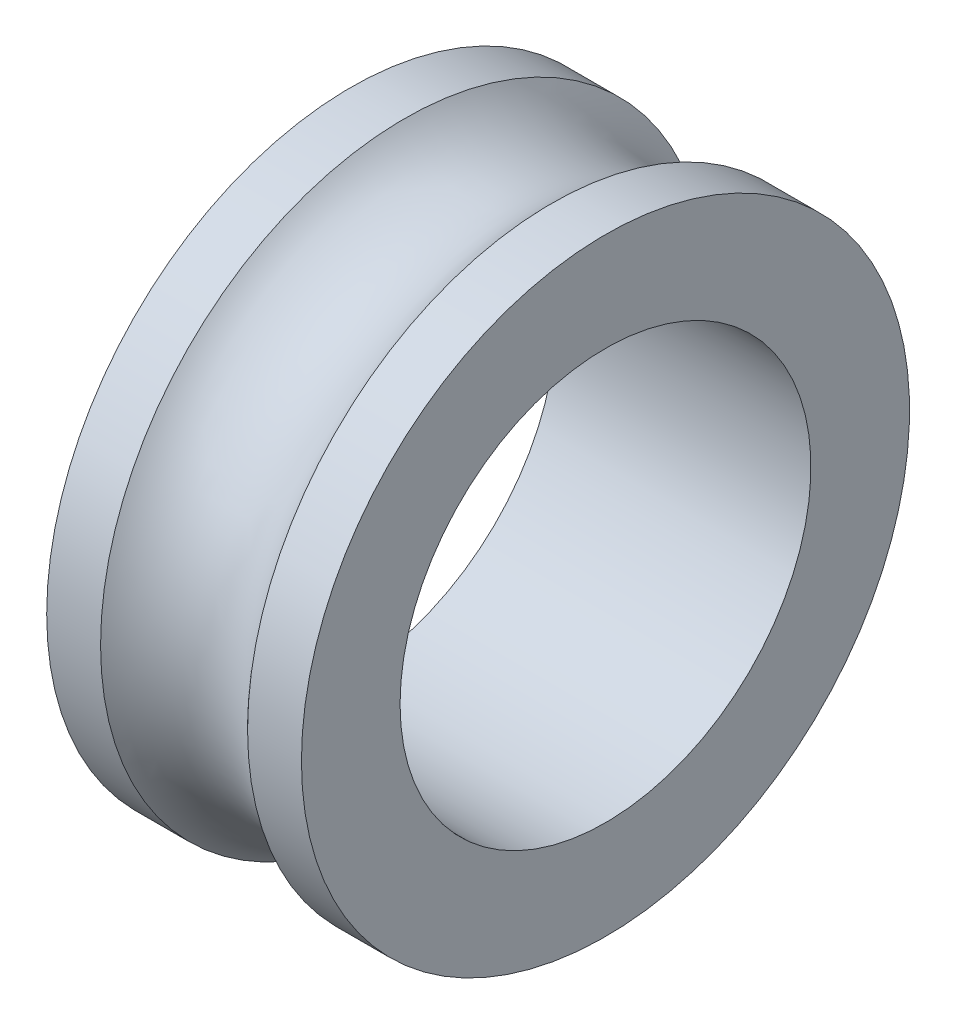
ISO-10303-21;
HEADER;
FILE_DESCRIPTION(('STEP AP214'),'2;1');
FILE_NAME('part.step','',(''),(''),'','','');
FILE_SCHEMA(('AUTOMOTIVE_DESIGN { 1 0 10303 214 1 1 1 1 }'));
ENDSEC;
DATA;
#1=APPLICATION_CONTEXT('core data for automotive mechanical design processes');
#2=APPLICATION_PROTOCOL_DEFINITION('international standard','automotive_design',2000,#1);
#3=PRODUCT_CONTEXT('',#1,'mechanical');
#4=PRODUCT('Part','Part','',(#3));
#5=PRODUCT_RELATED_PRODUCT_CATEGORY('part','',(#4));
#6=PRODUCT_DEFINITION_FORMATION('','',#4);
#7=PRODUCT_DEFINITION_CONTEXT('part definition',#1,'design');
#8=PRODUCT_DEFINITION('design','',#6,#7);
#9=PRODUCT_DEFINITION_SHAPE('','',#8);
#10=(LENGTH_UNIT() NAMED_UNIT(*) SI_UNIT(.MILLI.,.METRE.));
#11=(NAMED_UNIT(*) PLANE_ANGLE_UNIT() SI_UNIT($,.RADIAN.));
#12=(NAMED_UNIT(*) SI_UNIT($,.STERADIAN.) SOLID_ANGLE_UNIT());
#13=UNCERTAINTY_MEASURE_WITH_UNIT(LENGTH_MEASURE(1.E-05),#10,'distance_accuracy_value','');
#14=(GEOMETRIC_REPRESENTATION_CONTEXT(3) GLOBAL_UNCERTAINTY_ASSIGNED_CONTEXT((#13)) GLOBAL_UNIT_ASSIGNED_CONTEXT((#10,
#11,#12)) REPRESENTATION_CONTEXT('',''));
#15=CARTESIAN_POINT('',(0.,0.,0.));
#16=DIRECTION('',(0.,0.,1.));
#17=DIRECTION('',(1.,0.,0.));
#18=AXIS2_PLACEMENT_3D('',#15,#16,#17);
#19=CARTESIAN_POINT('',(0.,18.0793413173653,0.));
#20=DIRECTION('',(-1.,0.,0.));
#21=DIRECTION('',(0.,0.,1.));
#22=AXIS2_PLACEMENT_3D('',#19,#20,#21);
#23=PLANE('',#22);
#24=CARTESIAN_POINT('',(0.,-18.9206586826347,0.));
#25=DIRECTION('',(-1.,0.,0.));
#26=DIRECTION('',(0.,0.,1.));
#27=AXIS2_PLACEMENT_3D('',#24,#25,#26);
#28=CIRCLE('',#27,37.);
#29=CARTESIAN_POINT('',(0.,-18.9206586826347,37.));
#30=VERTEX_POINT('',#29);
#31=EDGE_CURVE('E10',#30,#30,#28,.T.);
#32=ORIENTED_EDGE('',*,*,#31,.F.);
#33=EDGE_LOOP('',(#32));
#34=FACE_BOUND('',#33,.T.);
#35=CARTESIAN_POINT('',(0.,-18.9206586826347,0.));
#36=DIRECTION('',(-1.,0.,0.));
#37=DIRECTION('',(0.,0.,1.));
#38=AXIS2_PLACEMENT_3D('',#35,#36,#37);
#39=CIRCLE('',#38,25.);
#40=CARTESIAN_POINT('',(0.,-18.9206586826347,25.));
#41=VERTEX_POINT('',#40);
#42=EDGE_CURVE('E53',#41,#41,#39,.T.);
#43=ORIENTED_EDGE('',*,*,#42,.T.);
#44=EDGE_LOOP('',(#43));
#45=FACE_BOUND('',#44,.T.);
#46=ADVANCED_FACE('F31',(#34,#45),#23,.F.);
#47=CARTESIAN_POINT('',(-31.185628742515,-18.9206586826347,0.));
#48=DIRECTION('',(-1.,0.,0.));
#49=DIRECTION('',(0.,0.,1.));
#50=AXIS2_PLACEMENT_3D('',#47,#48,#49);
#51=CYLINDRICAL_SURFACE('',#50,37.);
#52=CARTESIAN_POINT('',(-6.55572809000084,-18.9206586826347,0.));
#53=DIRECTION('',(-1.,0.,0.));
#54=DIRECTION('',(0.,0.,1.));
#55=AXIS2_PLACEMENT_3D('',#52,#53,#54);
#56=CIRCLE('',#55,37.);
#57=CARTESIAN_POINT('',(-6.55572809000084,-18.9206586826347,37.));
#58=VERTEX_POINT('',#57);
#59=EDGE_CURVE('E37',#58,#58,#56,.T.);
#60=ORIENTED_EDGE('',*,*,#59,.F.);
#61=EDGE_LOOP('',(#60));
#62=FACE_BOUND('',#61,.T.);
#63=ORIENTED_EDGE('',*,*,#31,.T.);
#64=EDGE_LOOP('',(#63));
#65=FACE_BOUND('',#64,.T.);
#66=ADVANCED_FACE('F78',(#62,#65),#51,.T.);
#67=CARTESIAN_POINT('',(-15.5,-18.9206586826347,0.));
#68=DIRECTION('',(-1.,0.,0.));
#69=DIRECTION('',(0.,0.,1.));
#70=AXIS2_PLACEMENT_3D('',#67,#68,#69);
#71=TOROIDAL_SURFACE('',#70,45.,12.);
#72=CARTESIAN_POINT('',(-24.4442719099992,-18.9206586826347,0.));
#73=DIRECTION('',(-1.,0.,0.));
#74=DIRECTION('',(0.,0.,1.));
#75=AXIS2_PLACEMENT_3D('',#72,#73,#74);
#76=CIRCLE('',#75,37.);
#77=CARTESIAN_POINT('',(-24.4442719099992,-18.9206586826347,37.));
#78=VERTEX_POINT('',#77);
#79=EDGE_CURVE('E41',#78,#78,#76,.T.);
#80=ORIENTED_EDGE('',*,*,#79,.F.);
#81=EDGE_LOOP('',(#80));
#82=FACE_BOUND('',#81,.T.);
#83=ORIENTED_EDGE('',*,*,#59,.T.);
#84=EDGE_LOOP('',(#83));
#85=FACE_BOUND('',#84,.T.);
#86=ADVANCED_FACE('F73',(#82,#85),#71,.F.);
#87=CARTESIAN_POINT('',(-31.185628742515,-18.9206586826347,0.));
#88=DIRECTION('',(-1.,0.,0.));
#89=DIRECTION('',(0.,0.,1.));
#90=AXIS2_PLACEMENT_3D('',#87,#88,#89);
#91=CYLINDRICAL_SURFACE('',#90,37.);
#92=CARTESIAN_POINT('',(-31.,-18.9206586826347,0.));
#93=DIRECTION('',(-1.,0.,0.));
#94=DIRECTION('',(0.,0.,1.));
#95=AXIS2_PLACEMENT_3D('',#92,#93,#94);
#96=CIRCLE('',#95,37.);
#97=CARTESIAN_POINT('',(-31.,-18.9206586826347,37.));
#98=VERTEX_POINT('',#97);
#99=EDGE_CURVE('E45',#98,#98,#96,.T.);
#100=ORIENTED_EDGE('',*,*,#99,.F.);
#101=EDGE_LOOP('',(#100));
#102=FACE_BOUND('',#101,.T.);
#103=ORIENTED_EDGE('',*,*,#79,.T.);
#104=EDGE_LOOP('',(#103));
#105=FACE_BOUND('',#104,.T.);
#106=ADVANCED_FACE('F67',(#102,#105),#91,.T.);
#107=CARTESIAN_POINT('',(-31.,18.0793413173653,0.));
#108=DIRECTION('',(1.,0.,0.));
#109=DIRECTION('',(0.,0.,-1.));
#110=AXIS2_PLACEMENT_3D('',#107,#108,#109);
#111=PLANE('',#110);
#112=CARTESIAN_POINT('',(-31.,-18.9206586826347,0.));
#113=DIRECTION('',(-1.,0.,0.));
#114=DIRECTION('',(0.,0.,1.));
#115=AXIS2_PLACEMENT_3D('',#112,#113,#114);
#116=CIRCLE('',#115,25.);
#117=CARTESIAN_POINT('',(-31.,-18.9206586826347,25.));
#118=VERTEX_POINT('',#117);
#119=EDGE_CURVE('E50',#118,#118,#116,.T.);
#120=ORIENTED_EDGE('',*,*,#119,.F.);
#121=EDGE_LOOP('',(#120));
#122=FACE_BOUND('',#121,.T.);
#123=ORIENTED_EDGE('',*,*,#99,.T.);
#124=EDGE_LOOP('',(#123));
#125=FACE_BOUND('',#124,.T.);
#126=ADVANCED_FACE('F61',(#122,#125),#111,.F.);
#127=CARTESIAN_POINT('',(-31.185628742515,-18.9206586826347,0.));
#128=DIRECTION('',(-1.,0.,0.));
#129=DIRECTION('',(0.,0.,1.));
#130=AXIS2_PLACEMENT_3D('',#127,#128,#129);
#131=CYLINDRICAL_SURFACE('',#130,25.);
#132=ORIENTED_EDGE('',*,*,#42,.F.);
#133=EDGE_LOOP('',(#132));
#134=FACE_BOUND('',#133,.T.);
#135=ORIENTED_EDGE('',*,*,#119,.T.);
#136=EDGE_LOOP('',(#135));
#137=FACE_BOUND('',#136,.T.);
#138=ADVANCED_FACE('F58',(#134,#137),#131,.F.);
#139=CLOSED_SHELL('',(#46,#66,#86,#106,#126,#138));
#140=MANIFOLD_SOLID_BREP('B2',#139);
#141=ADVANCED_BREP_SHAPE_REPRESENTATION('',(#18,#140),#14);
#142=SHAPE_DEFINITION_REPRESENTATION(#9,#141);
ENDSEC;
END-ISO-10303-21;
